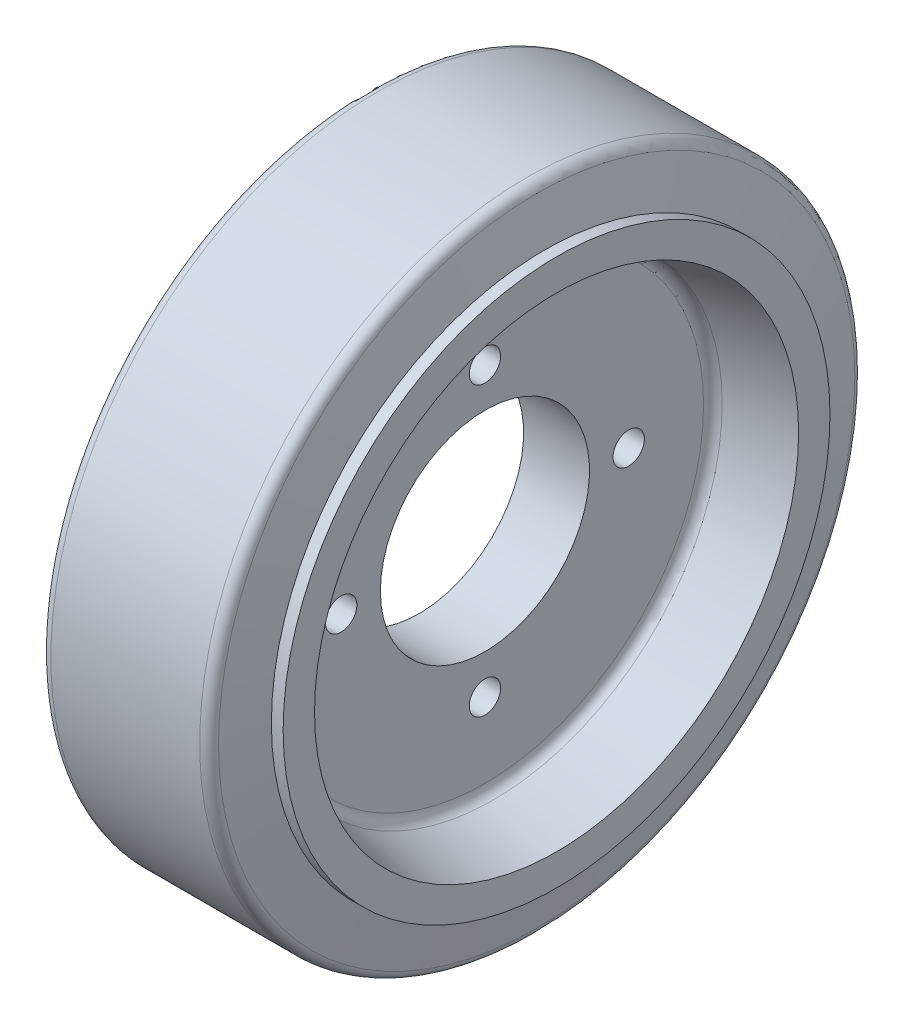
ISO-10303-21;
HEADER;
FILE_DESCRIPTION(('STEP AP214'),'2;1');
FILE_NAME('part.step','',(''),(''),'','','');
FILE_SCHEMA(('AUTOMOTIVE_DESIGN { 1 0 10303 214 1 1 1 1 }'));
ENDSEC;
DATA;
#1=APPLICATION_CONTEXT('core data for automotive mechanical design processes');
#2=APPLICATION_PROTOCOL_DEFINITION('international standard','automotive_design',2000,#1);
#3=PRODUCT_CONTEXT('',#1,'mechanical');
#4=PRODUCT('Part','Part','',(#3));
#5=PRODUCT_RELATED_PRODUCT_CATEGORY('part','',(#4));
#6=PRODUCT_DEFINITION_FORMATION('','',#4);
#7=PRODUCT_DEFINITION_CONTEXT('part definition',#1,'design');
#8=PRODUCT_DEFINITION('design','',#6,#7);
#9=PRODUCT_DEFINITION_SHAPE('','',#8);
#10=(LENGTH_UNIT() NAMED_UNIT(*) SI_UNIT(.MILLI.,.METRE.));
#11=(NAMED_UNIT(*) PLANE_ANGLE_UNIT() SI_UNIT($,.RADIAN.));
#12=(NAMED_UNIT(*) SI_UNIT($,.STERADIAN.) SOLID_ANGLE_UNIT());
#13=UNCERTAINTY_MEASURE_WITH_UNIT(LENGTH_MEASURE(1.E-05),#10,'distance_accuracy_value','');
#14=(GEOMETRIC_REPRESENTATION_CONTEXT(3) GLOBAL_UNCERTAINTY_ASSIGNED_CONTEXT((#13)) GLOBAL_UNIT_ASSIGNED_CONTEXT((#10,
#11,#12)) REPRESENTATION_CONTEXT('',''));
#15=CARTESIAN_POINT('',(0.,0.,0.));
#16=DIRECTION('',(0.,0.,1.));
#17=DIRECTION('',(1.,0.,0.));
#18=AXIS2_PLACEMENT_3D('',#15,#16,#17);
#19=CARTESIAN_POINT('',(15.9,0.,0.));
#20=DIRECTION('',(-1.,0.,0.));
#21=DIRECTION('',(0.,0.,1.));
#22=AXIS2_PLACEMENT_3D('',#19,#20,#21);
#23=CONICAL_SURFACE('',#22,62.5,1.39137423336047);
#24=CARTESIAN_POINT('',(16.1980092545903,0.,0.));
#25=DIRECTION('',(1.,0.,0.));
#26=DIRECTION('',(0.,0.,-1.));
#27=AXIS2_PLACEMENT_3D('',#24,#25,#26);
#28=CIRCLE('',#27,60.8569219476642);
#29=CARTESIAN_POINT('',(16.1980092545903,0.,-60.8569219476642));
#30=VERTEX_POINT('',#29);
#31=EDGE_CURVE('E10',#30,#30,#28,.T.);
#32=ORIENTED_EDGE('',*,*,#31,.T.);
#33=EDGE_LOOP('',(#32));
#34=FACE_BOUND('',#33,.T.);
#35=CARTESIAN_POINT('',(17.75,0.,0.));
#36=DIRECTION('',(-1.,0.,0.));
#37=DIRECTION('',(0.,0.,1.));
#38=AXIS2_PLACEMENT_3D('',#35,#36,#37);
#39=CIRCLE('',#38,52.3);
#40=CARTESIAN_POINT('',(17.75,0.,52.3));
#41=VERTEX_POINT('',#40);
#42=EDGE_CURVE('E74',#41,#41,#39,.T.);
#43=ORIENTED_EDGE('',*,*,#42,.T.);
#44=EDGE_LOOP('',(#43));
#45=FACE_BOUND('',#44,.T.);
#46=ADVANCED_FACE('F42',(#34,#45),#23,.T.);
#47=CARTESIAN_POINT('',(0.,0.,0.));
#48=DIRECTION('',(-1.,0.,0.));
#49=DIRECTION('',(0.,0.,1.));
#50=AXIS2_PLACEMENT_3D('',#47,#48,#49);
#51=CYLINDRICAL_SURFACE('',#50,52.3);
#52=CARTESIAN_POINT('',(20.,0.,0.));
#53=DIRECTION('',(-1.,0.,0.));
#54=DIRECTION('',(0.,0.,1.));
#55=AXIS2_PLACEMENT_3D('',#52,#53,#54);
#56=CIRCLE('',#55,52.3);
#57=CARTESIAN_POINT('',(20.,0.,52.3));
#58=VERTEX_POINT('',#57);
#59=EDGE_CURVE('E77',#58,#58,#56,.T.);
#60=ORIENTED_EDGE('',*,*,#59,.T.);
#61=EDGE_LOOP('',(#60));
#62=FACE_BOUND('',#61,.T.);
#63=ORIENTED_EDGE('',*,*,#42,.F.);
#64=EDGE_LOOP('',(#63));
#65=FACE_BOUND('',#64,.T.);
#66=ADVANCED_FACE('F155',(#62,#65),#51,.T.);
#67=CARTESIAN_POINT('',(20.,-52.3,0.));
#68=DIRECTION('',(1.,0.,0.));
#69=DIRECTION('',(0.,0.,-1.));
#70=AXIS2_PLACEMENT_3D('',#67,#68,#69);
#71=PLANE('',#70);
#72=CARTESIAN_POINT('',(20.,0.,0.));
#73=DIRECTION('',(-1.,0.,0.));
#74=DIRECTION('',(0.,0.,1.));
#75=AXIS2_PLACEMENT_3D('',#72,#73,#74);
#76=CIRCLE('',#75,46.3);
#77=CARTESIAN_POINT('',(20.,0.,46.3));
#78=VERTEX_POINT('',#77);
#79=EDGE_CURVE('E80',#78,#78,#76,.T.);
#80=ORIENTED_EDGE('',*,*,#79,.T.);
#81=EDGE_LOOP('',(#80));
#82=FACE_BOUND('',#81,.T.);
#83=ORIENTED_EDGE('',*,*,#59,.F.);
#84=EDGE_LOOP('',(#83));
#85=FACE_BOUND('',#84,.T.);
#86=ADVANCED_FACE('F160',(#82,#85),#71,.T.);
#87=CARTESIAN_POINT('',(20.,0.,0.));
#88=DIRECTION('',(1.,0.,0.));
#89=DIRECTION('',(0.,0.,-1.));
#90=AXIS2_PLACEMENT_3D('',#87,#88,#89);
#91=CONICAL_SURFACE('',#90,46.3,0.205103886501625);
#92=CARTESIAN_POINT('',(7.89266225994668,0.,0.));
#93=DIRECTION('',(1.,0.,0.));
#94=DIRECTION('',(0.,0.,-1.));
#95=AXIS2_PLACEMENT_3D('',#92,#93,#94);
#96=CIRCLE('',#95,43.7813202511568);
#97=CARTESIAN_POINT('',(7.89266225994668,0.,-43.7813202511568));
#98=VERTEX_POINT('',#97);
#99=EDGE_CURVE('E71',#98,#98,#96,.F.);
#100=ORIENTED_EDGE('',*,*,#99,.T.);
#101=EDGE_LOOP('',(#100));
#102=FACE_BOUND('',#101,.T.);
#103=ORIENTED_EDGE('',*,*,#79,.F.);
#104=EDGE_LOOP('',(#103));
#105=FACE_BOUND('',#104,.T.);
#106=ADVANCED_FACE('F167',(#102,#105),#91,.F.);
#107=CARTESIAN_POINT('',(6.3,-43.45,0.));
#108=DIRECTION('',(1.,0.,0.));
#109=DIRECTION('',(0.,0.,-1.));
#110=AXIS2_PLACEMENT_3D('',#107,#108,#109);
#111=PLANE('',#110);
#112=CARTESIAN_POINT('',(6.3,0.,27.5));
#113=DIRECTION('',(1.,0.,0.));
#114=DIRECTION('',(0.,0.,-1.));
#115=AXIS2_PLACEMENT_3D('',#112,#113,#114);
#116=CIRCLE('',#115,3.);
#117=CARTESIAN_POINT('',(6.3,0.,24.5));
#118=VERTEX_POINT('',#117);
#119=EDGE_CURVE('E113',#118,#118,#116,.T.);
#120=ORIENTED_EDGE('',*,*,#119,.F.);
#121=EDGE_LOOP('',(#120));
#122=FACE_BOUND('',#121,.T.);
#123=CARTESIAN_POINT('',(6.3,-27.5,0.));
#124=DIRECTION('',(1.,0.,0.));
#125=DIRECTION('',(0.,0.,-1.));
#126=AXIS2_PLACEMENT_3D('',#123,#124,#125);
#127=CIRCLE('',#126,3.);
#128=CARTESIAN_POINT('',(6.3,-27.5,-3.));
#129=VERTEX_POINT('',#128);
#130=EDGE_CURVE('E107',#129,#129,#127,.T.);
#131=ORIENTED_EDGE('',*,*,#130,.F.);
#132=EDGE_LOOP('',(#131));
#133=FACE_BOUND('',#132,.T.);
#134=CARTESIAN_POINT('',(6.3,0.,-27.5));
#135=DIRECTION('',(1.,0.,0.));
#136=DIRECTION('',(0.,0.,-1.));
#137=AXIS2_PLACEMENT_3D('',#134,#135,#136);
#138=CIRCLE('',#137,3.);
#139=CARTESIAN_POINT('',(6.3,0.,-30.5));
#140=VERTEX_POINT('',#139);
#141=EDGE_CURVE('E101',#140,#140,#138,.T.);
#142=ORIENTED_EDGE('',*,*,#141,.F.);
#143=EDGE_LOOP('',(#142));
#144=FACE_BOUND('',#143,.T.);
#145=CARTESIAN_POINT('',(6.3,27.5,0.));
#146=DIRECTION('',(1.,0.,0.));
#147=DIRECTION('',(0.,0.,-1.));
#148=AXIS2_PLACEMENT_3D('',#145,#146,#147);
#149=CIRCLE('',#148,3.);
#150=CARTESIAN_POINT('',(6.3,27.5,-3.));
#151=VERTEX_POINT('',#150);
#152=EDGE_CURVE('E95',#151,#151,#149,.T.);
#153=ORIENTED_EDGE('',*,*,#152,.F.);
#154=EDGE_LOOP('',(#153));
#155=FACE_BOUND('',#154,.T.);
#156=CARTESIAN_POINT('',(6.3,0.,0.));
#157=DIRECTION('',(1.,0.,0.));
#158=DIRECTION('',(0.,0.,-1.));
#159=AXIS2_PLACEMENT_3D('',#156,#157,#158);
#160=CIRCLE('',#159,20.);
#161=CARTESIAN_POINT('',(6.3,0.,20.));
#162=VERTEX_POINT('',#161);
#163=EDGE_CURVE('E92',#162,#162,#160,.T.);
#164=ORIENTED_EDGE('',*,*,#163,.F.);
#165=EDGE_LOOP('',(#164));
#166=FACE_BOUND('',#165,.T.);
#167=CARTESIAN_POINT('',(6.3,0.,0.));
#168=DIRECTION('',(1.,0.,0.));
#169=DIRECTION('',(0.,0.,-1.));
#170=AXIS2_PLACEMENT_3D('',#167,#168,#169);
#171=CIRCLE('',#170,41.8232405884443);
#172=CARTESIAN_POINT('',(6.3,0.,-41.8232405884443));
#173=VERTEX_POINT('',#172);
#174=EDGE_CURVE('E68',#173,#173,#171,.T.);
#175=ORIENTED_EDGE('',*,*,#174,.T.);
#176=EDGE_LOOP('',(#175));
#177=FACE_BOUND('',#176,.T.);
#178=ADVANCED_FACE('F126',(#122,#133,#144,#155,#166,#177),#111,.T.);
#179=CARTESIAN_POINT('',(-6.3,-43.45,0.));
#180=DIRECTION('',(-1.,0.,0.));
#181=DIRECTION('',(0.,0.,1.));
#182=AXIS2_PLACEMENT_3D('',#179,#180,#181);
#183=PLANE('',#182);
#184=CARTESIAN_POINT('',(-6.3,0.,27.5));
#185=DIRECTION('',(-1.,0.,0.));
#186=DIRECTION('',(0.,0.,1.));
#187=AXIS2_PLACEMENT_3D('',#184,#185,#186);
#188=CIRCLE('',#187,3.);
#189=CARTESIAN_POINT('',(-6.3,0.,30.5));
#190=VERTEX_POINT('',#189);
#191=EDGE_CURVE('E116',#190,#190,#188,.T.);
#192=ORIENTED_EDGE('',*,*,#191,.F.);
#193=EDGE_LOOP('',(#192));
#194=FACE_BOUND('',#193,.T.);
#195=CARTESIAN_POINT('',(-6.3,-27.5,0.));
#196=DIRECTION('',(-1.,0.,0.));
#197=DIRECTION('',(0.,0.,1.));
#198=AXIS2_PLACEMENT_3D('',#195,#196,#197);
#199=CIRCLE('',#198,3.);
#200=CARTESIAN_POINT('',(-6.3,-27.5,3.));
#201=VERTEX_POINT('',#200);
#202=EDGE_CURVE('E110',#201,#201,#199,.T.);
#203=ORIENTED_EDGE('',*,*,#202,.F.);
#204=EDGE_LOOP('',(#203));
#205=FACE_BOUND('',#204,.T.);
#206=CARTESIAN_POINT('',(-6.3,0.,-27.5));
#207=DIRECTION('',(-1.,0.,0.));
#208=DIRECTION('',(0.,0.,1.));
#209=AXIS2_PLACEMENT_3D('',#206,#207,#208);
#210=CIRCLE('',#209,3.);
#211=CARTESIAN_POINT('',(-6.3,0.,-24.5));
#212=VERTEX_POINT('',#211);
#213=EDGE_CURVE('E104',#212,#212,#210,.T.);
#214=ORIENTED_EDGE('',*,*,#213,.F.);
#215=EDGE_LOOP('',(#214));
#216=FACE_BOUND('',#215,.T.);
#217=CARTESIAN_POINT('',(-6.3,27.5,0.));
#218=DIRECTION('',(-1.,0.,0.));
#219=DIRECTION('',(0.,0.,1.));
#220=AXIS2_PLACEMENT_3D('',#217,#218,#219);
#221=CIRCLE('',#220,3.);
#222=CARTESIAN_POINT('',(-6.3,27.5,3.));
#223=VERTEX_POINT('',#222);
#224=EDGE_CURVE('E98',#223,#223,#221,.T.);
#225=ORIENTED_EDGE('',*,*,#224,.F.);
#226=EDGE_LOOP('',(#225));
#227=FACE_BOUND('',#226,.T.);
#228=CARTESIAN_POINT('',(-6.3,0.,0.));
#229=DIRECTION('',(-1.,0.,0.));
#230=DIRECTION('',(0.,0.,1.));
#231=AXIS2_PLACEMENT_3D('',#228,#229,#230);
#232=CIRCLE('',#231,20.);
#233=CARTESIAN_POINT('',(-6.3,0.,20.));
#234=VERTEX_POINT('',#233);
#235=EDGE_CURVE('E46',#234,#234,#232,.T.);
#236=ORIENTED_EDGE('',*,*,#235,.F.);
#237=EDGE_LOOP('',(#236));
#238=FACE_BOUND('',#237,.T.);
#239=CARTESIAN_POINT('',(-6.3,0.,0.));
#240=DIRECTION('',(-1.,0.,0.));
#241=DIRECTION('',(0.,0.,1.));
#242=AXIS2_PLACEMENT_3D('',#239,#240,#241);
#243=CIRCLE('',#242,41.8232405884443);
#244=CARTESIAN_POINT('',(-6.3,0.,41.8232405884443));
#245=VERTEX_POINT('',#244);
#246=EDGE_CURVE('E65',#245,#245,#243,.T.);
#247=ORIENTED_EDGE('',*,*,#246,.T.);
#248=EDGE_LOOP('',(#247));
#249=FACE_BOUND('',#248,.T.);
#250=ADVANCED_FACE('F122',(#194,#205,#216,#227,#238,#249),#183,.T.);
#251=CARTESIAN_POINT('',(-6.3,0.,0.));
#252=DIRECTION('',(-1.,0.,0.));
#253=DIRECTION('',(0.,0.,1.));
#254=AXIS2_PLACEMENT_3D('',#251,#252,#253);
#255=CONICAL_SURFACE('',#254,43.45,0.205103886501625);
#256=CARTESIAN_POINT('',(-7.89266225994668,0.,0.));
#257=DIRECTION('',(-1.,0.,0.));
#258=DIRECTION('',(0.,0.,1.));
#259=AXIS2_PLACEMENT_3D('',#256,#257,#258);
#260=CIRCLE('',#259,43.7813202511568);
#261=CARTESIAN_POINT('',(-7.89266225994668,0.,43.7813202511568));
#262=VERTEX_POINT('',#261);
#263=EDGE_CURVE('E62',#262,#262,#260,.F.);
#264=ORIENTED_EDGE('',*,*,#263,.T.);
#265=EDGE_LOOP('',(#264));
#266=FACE_BOUND('',#265,.T.);
#267=CARTESIAN_POINT('',(-20.,0.,0.));
#268=DIRECTION('',(-1.,0.,0.));
#269=DIRECTION('',(0.,0.,1.));
#270=AXIS2_PLACEMENT_3D('',#267,#268,#269);
#271=CIRCLE('',#270,46.3);
#272=CARTESIAN_POINT('',(-20.,0.,46.3));
#273=VERTEX_POINT('',#272);
#274=EDGE_CURVE('E83',#273,#273,#271,.T.);
#275=ORIENTED_EDGE('',*,*,#274,.T.);
#276=EDGE_LOOP('',(#275));
#277=FACE_BOUND('',#276,.T.);
#278=ADVANCED_FACE('F125',(#266,#277),#255,.F.);
#279=CARTESIAN_POINT('',(-20.,-52.3,0.));
#280=DIRECTION('',(-1.,0.,0.));
#281=DIRECTION('',(0.,0.,1.));
#282=AXIS2_PLACEMENT_3D('',#279,#280,#281);
#283=PLANE('',#282);
#284=CARTESIAN_POINT('',(-20.,0.,0.));
#285=DIRECTION('',(-1.,0.,0.));
#286=DIRECTION('',(0.,0.,1.));
#287=AXIS2_PLACEMENT_3D('',#284,#285,#286);
#288=CIRCLE('',#287,52.3);
#289=CARTESIAN_POINT('',(-20.,0.,52.3));
#290=VERTEX_POINT('',#289);
#291=EDGE_CURVE('E86',#290,#290,#288,.T.);
#292=ORIENTED_EDGE('',*,*,#291,.T.);
#293=EDGE_LOOP('',(#292));
#294=FACE_BOUND('',#293,.T.);
#295=ORIENTED_EDGE('',*,*,#274,.F.);
#296=EDGE_LOOP('',(#295));
#297=FACE_BOUND('',#296,.T.);
#298=ADVANCED_FACE('F177',(#294,#297),#283,.T.);
#299=CARTESIAN_POINT('',(0.,0.,0.));
#300=DIRECTION('',(-1.,0.,0.));
#301=DIRECTION('',(0.,0.,1.));
#302=AXIS2_PLACEMENT_3D('',#299,#300,#301);
#303=CYLINDRICAL_SURFACE('',#302,52.3);
#304=CARTESIAN_POINT('',(-17.75,0.,0.));
#305=DIRECTION('',(-1.,0.,0.));
#306=DIRECTION('',(0.,0.,1.));
#307=AXIS2_PLACEMENT_3D('',#304,#305,#306);
#308=CIRCLE('',#307,52.3);
#309=CARTESIAN_POINT('',(-17.75,0.,52.3));
#310=VERTEX_POINT('',#309);
#311=EDGE_CURVE('E89',#310,#310,#308,.T.);
#312=ORIENTED_EDGE('',*,*,#311,.T.);
#313=EDGE_LOOP('',(#312));
#314=FACE_BOUND('',#313,.T.);
#315=ORIENTED_EDGE('',*,*,#291,.F.);
#316=EDGE_LOOP('',(#315));
#317=FACE_BOUND('',#316,.T.);
#318=ADVANCED_FACE('F181',(#314,#317),#303,.T.);
#319=CARTESIAN_POINT('',(-17.75,0.,0.));
#320=DIRECTION('',(1.,0.,0.));
#321=DIRECTION('',(0.,0.,-1.));
#322=AXIS2_PLACEMENT_3D('',#319,#320,#321);
#323=CONICAL_SURFACE('',#322,52.3,1.39137423336047);
#324=CARTESIAN_POINT('',(-16.1980092545903,0.,0.));
#325=DIRECTION('',(-1.,0.,0.));
#326=DIRECTION('',(0.,0.,1.));
#327=AXIS2_PLACEMENT_3D('',#324,#325,#326);
#328=CIRCLE('',#327,60.8569219476642);
#329=CARTESIAN_POINT('',(-16.1980092545903,0.,60.8569219476642));
#330=VERTEX_POINT('',#329);
#331=EDGE_CURVE('E59',#330,#330,#328,.T.);
#332=ORIENTED_EDGE('',*,*,#331,.T.);
#333=EDGE_LOOP('',(#332));
#334=FACE_BOUND('',#333,.T.);
#335=ORIENTED_EDGE('',*,*,#311,.F.);
#336=EDGE_LOOP('',(#335));
#337=FACE_BOUND('',#336,.T.);
#338=ADVANCED_FACE('F185',(#334,#337),#323,.T.);
#339=CARTESIAN_POINT('',(0.,0.,0.));
#340=DIRECTION('',(-1.,0.,0.));
#341=DIRECTION('',(0.,0.,1.));
#342=AXIS2_PLACEMENT_3D('',#339,#340,#341);
#343=CYLINDRICAL_SURFACE('',#342,62.5);
#344=CARTESIAN_POINT('',(-14.2301152728739,0.,0.));
#345=DIRECTION('',(1.,0.,0.));
#346=DIRECTION('',(0.,0.,-1.));
#347=AXIS2_PLACEMENT_3D('',#344,#345,#346);
#348=CIRCLE('',#347,62.5);
#349=CARTESIAN_POINT('',(-14.2301152728739,0.,-62.5));
#350=VERTEX_POINT('',#349);
#351=EDGE_CURVE('E50',#350,#350,#348,.T.);
#352=ORIENTED_EDGE('',*,*,#351,.T.);
#353=EDGE_LOOP('',(#352));
#354=FACE_BOUND('',#353,.T.);
#355=CARTESIAN_POINT('',(14.2301152728739,0.,0.));
#356=DIRECTION('',(1.,0.,0.));
#357=DIRECTION('',(0.,0.,-1.));
#358=AXIS2_PLACEMENT_3D('',#355,#356,#357);
#359=CIRCLE('',#358,62.5);
#360=CARTESIAN_POINT('',(14.2301152728739,0.,-62.5));
#361=VERTEX_POINT('',#360);
#362=EDGE_CURVE('E54',#361,#361,#359,.F.);
#363=ORIENTED_EDGE('',*,*,#362,.T.);
#364=EDGE_LOOP('',(#363));
#365=FACE_BOUND('',#364,.T.);
#366=ADVANCED_FACE('F150',(#354,#365),#343,.T.);
#367=CARTESIAN_POINT('',(8.3,0.,0.));
#368=DIRECTION('',(1.,0.,0.));
#369=DIRECTION('',(0.,0.,-1.));
#370=AXIS2_PLACEMENT_3D('',#367,#368,#369);
#371=TOROIDAL_SURFACE('',#370,41.8232405884443,2.);
#372=ORIENTED_EDGE('',*,*,#174,.F.);
#373=EDGE_LOOP('',(#372));
#374=FACE_BOUND('',#373,.T.);
#375=ORIENTED_EDGE('',*,*,#99,.F.);
#376=EDGE_LOOP('',(#375));
#377=FACE_BOUND('',#376,.T.);
#378=ADVANCED_FACE('F142',(#374,#377),#371,.F.);
#379=CARTESIAN_POINT('',(-8.3,0.,0.));
#380=DIRECTION('',(-1.,0.,0.));
#381=DIRECTION('',(0.,0.,1.));
#382=AXIS2_PLACEMENT_3D('',#379,#380,#381);
#383=TOROIDAL_SURFACE('',#382,41.8232405884443,2.);
#384=ORIENTED_EDGE('',*,*,#263,.F.);
#385=EDGE_LOOP('',(#384));
#386=FACE_BOUND('',#385,.T.);
#387=ORIENTED_EDGE('',*,*,#246,.F.);
#388=EDGE_LOOP('',(#387));
#389=FACE_BOUND('',#388,.T.);
#390=ADVANCED_FACE('F139',(#386,#389),#383,.F.);
#391=CARTESIAN_POINT('',(-14.2301152728739,0.,0.));
#392=DIRECTION('',(1.,0.,0.));
#393=DIRECTION('',(0.,0.,-1.));
#394=AXIS2_PLACEMENT_3D('',#391,#392,#393);
#395=TOROIDAL_SURFACE('',#394,60.5,2.);
#396=ORIENTED_EDGE('',*,*,#351,.F.);
#397=EDGE_LOOP('',(#396));
#398=FACE_BOUND('',#397,.T.);
#399=ORIENTED_EDGE('',*,*,#331,.F.);
#400=EDGE_LOOP('',(#399));
#401=FACE_BOUND('',#400,.T.);
#402=ADVANCED_FACE('F141',(#398,#401),#395,.T.);
#403=CARTESIAN_POINT('',(14.2301152728739,0.,0.));
#404=DIRECTION('',(1.,0.,0.));
#405=DIRECTION('',(0.,0.,-1.));
#406=AXIS2_PLACEMENT_3D('',#403,#404,#405);
#407=TOROIDAL_SURFACE('',#406,60.5,2.);
#408=ORIENTED_EDGE('',*,*,#31,.F.);
#409=EDGE_LOOP('',(#408));
#410=FACE_BOUND('',#409,.T.);
#411=ORIENTED_EDGE('',*,*,#362,.F.);
#412=EDGE_LOOP('',(#411));
#413=FACE_BOUND('',#412,.T.);
#414=ADVANCED_FACE('F44',(#410,#413),#407,.T.);
#415=CARTESIAN_POINT('',(22.2,0.,0.));
#416=DIRECTION('',(-1.,0.,0.));
#417=DIRECTION('',(0.,0.,1.));
#418=AXIS2_PLACEMENT_3D('',#415,#416,#417);
#419=CYLINDRICAL_SURFACE('',#418,20.);
#420=CARTESIAN_POINT('',(6.3,0.,20.));
#421=CARTESIAN_POINT('',(6.16875,0.,20.));
#422=CARTESIAN_POINT('',(6.0375,0.,20.));
#423=CARTESIAN_POINT('',(5.775,0.,20.));
#424=CARTESIAN_POINT('',(5.64375,0.,20.));
#425=CARTESIAN_POINT('',(5.38125,0.,20.));
#426=CARTESIAN_POINT('',(5.25,0.,20.));
#427=CARTESIAN_POINT('',(4.9875,0.,20.));
#428=CARTESIAN_POINT('',(4.85625,0.,20.));
#429=CARTESIAN_POINT('',(4.59375,0.,20.));
#430=CARTESIAN_POINT('',(4.4625,0.,20.));
#431=CARTESIAN_POINT('',(4.2,0.,20.));
#432=CARTESIAN_POINT('',(4.06875,0.,20.));
#433=CARTESIAN_POINT('',(3.80625,0.,20.));
#434=CARTESIAN_POINT('',(3.675,0.,20.));
#435=CARTESIAN_POINT('',(3.4125,0.,20.));
#436=CARTESIAN_POINT('',(3.28125,0.,20.));
#437=CARTESIAN_POINT('',(3.01875,0.,20.));
#438=CARTESIAN_POINT('',(2.8875,0.,20.));
#439=CARTESIAN_POINT('',(2.625,0.,20.));
#440=CARTESIAN_POINT('',(2.49375,0.,20.));
#441=CARTESIAN_POINT('',(2.23125,0.,20.));
#442=CARTESIAN_POINT('',(2.1,0.,20.));
#443=CARTESIAN_POINT('',(1.8375,0.,20.));
#444=CARTESIAN_POINT('',(1.70625,0.,20.));
#445=CARTESIAN_POINT('',(1.44375,0.,20.));
#446=CARTESIAN_POINT('',(1.3125,0.,20.));
#447=CARTESIAN_POINT('',(1.05,0.,20.));
#448=CARTESIAN_POINT('',(0.918750000000001,0.,20.));
#449=CARTESIAN_POINT('',(0.656249999999999,0.,20.));
#450=CARTESIAN_POINT('',(0.524999999999999,0.,20.));
#451=CARTESIAN_POINT('',(0.262499999999999,0.,20.));
#452=CARTESIAN_POINT('',(0.131249999999999,0.,20.));
#453=CARTESIAN_POINT('',(-0.131249999999999,0.,20.));
#454=CARTESIAN_POINT('',(-0.262499999999999,0.,20.));
#455=CARTESIAN_POINT('',(-0.524999999999999,0.,20.));
#456=CARTESIAN_POINT('',(-0.656249999999999,0.,20.));
#457=CARTESIAN_POINT('',(-0.918750000000001,0.,20.));
#458=CARTESIAN_POINT('',(-1.05,0.,20.));
#459=CARTESIAN_POINT('',(-1.3125,0.,20.));
#460=CARTESIAN_POINT('',(-1.44375,0.,20.));
#461=CARTESIAN_POINT('',(-1.70625,0.,20.));
#462=CARTESIAN_POINT('',(-1.8375,0.,20.));
#463=CARTESIAN_POINT('',(-2.1,0.,20.));
#464=CARTESIAN_POINT('',(-2.23125,0.,20.));
#465=CARTESIAN_POINT('',(-2.49375,0.,20.));
#466=CARTESIAN_POINT('',(-2.625,0.,20.));
#467=CARTESIAN_POINT('',(-2.8875,0.,20.));
#468=CARTESIAN_POINT('',(-3.01875,0.,20.));
#469=CARTESIAN_POINT('',(-3.28125,0.,20.));
#470=CARTESIAN_POINT('',(-3.4125,0.,20.));
#471=CARTESIAN_POINT('',(-3.675,0.,20.));
#472=CARTESIAN_POINT('',(-3.80625,0.,20.));
#473=CARTESIAN_POINT('',(-4.06875,0.,20.));
#474=CARTESIAN_POINT('',(-4.2,0.,20.));
#475=CARTESIAN_POINT('',(-4.4625,0.,20.));
#476=CARTESIAN_POINT('',(-4.59375,0.,20.));
#477=CARTESIAN_POINT('',(-4.85625,0.,20.));
#478=CARTESIAN_POINT('',(-4.9875,0.,20.));
#479=CARTESIAN_POINT('',(-5.25,0.,20.));
#480=CARTESIAN_POINT('',(-5.38125,0.,20.));
#481=CARTESIAN_POINT('',(-5.64375,0.,20.));
#482=CARTESIAN_POINT('',(-5.775,0.,20.));
#483=CARTESIAN_POINT('',(-6.0375,0.,20.));
#484=CARTESIAN_POINT('',(-6.16875,0.,20.));
#485=CARTESIAN_POINT('',(-6.3,0.,20.));
#486=B_SPLINE_CURVE_WITH_KNOTS('',3,(#420,#421,#422,#423,#424,#425,#426,#427,#428,#429,#430,
#431,#432,#433,#434,#435,#436,#437,#438,#439,#440,#441,#442,#443,#444,#445,#446,#447,#448,#449,
#450,#451,#452,#453,#454,#455,#456,#457,#458,#459,#460,#461,#462,#463,#464,#465,#466,#467,#468,
#469,#470,#471,#472,#473,#474,#475,#476,#477,#478,#479,#480,#481,#482,#483,#484,#485),
.UNSPECIFIED.,.F.,.F.,(4,2,2,2,2,2,2,2,2,2,2,2,2,2,2,2,2,2,2,2,2,2,2,2,2,2,2,2,2,2,2,2,4),(0.,
0.393749999999998,0.7875,1.18125,1.575,1.96875,2.3625,2.75625,3.15,3.54375,3.9375,4.33125,4.725,
5.11875,5.5125,5.90625,6.3,6.69375,7.0875,7.48125,7.875,8.26875,8.6625,9.05625,9.45,9.84375,
10.2375,10.63125,11.025,11.41875,11.8125,12.20625,12.6),.UNSPECIFIED.);
#487=EDGE_CURVE('BSEAM193',#162,#234,#486,.T.);
#488=ORIENTED_EDGE('',*,*,#163,.T.);
#489=ORIENTED_EDGE('',*,*,#235,.T.);
#490=ORIENTED_EDGE('',*,*,#487,.T.);
#491=ORIENTED_EDGE('',*,*,#487,.F.);
#492=EDGE_LOOP('',(#488,#490,#489,#491));
#493=FACE_BOUND('',#492,.T.);
#494=ADVANCED_FACE('F193',(#493),#419,.F.);
#495=CARTESIAN_POINT('',(20.,27.5,0.));
#496=DIRECTION('',(-1.,0.,0.));
#497=DIRECTION('',(0.,0.,1.));
#498=AXIS2_PLACEMENT_3D('',#495,#496,#497);
#499=CYLINDRICAL_SURFACE('',#498,3.);
#500=ORIENTED_EDGE('',*,*,#152,.T.);
#501=EDGE_LOOP('',(#500));
#502=FACE_BOUND('',#501,.T.);
#503=ORIENTED_EDGE('',*,*,#224,.T.);
#504=EDGE_LOOP('',(#503));
#505=FACE_BOUND('',#504,.T.);
#506=ADVANCED_FACE('F196',(#502,#505),#499,.F.);
#507=CARTESIAN_POINT('',(20.,0.,-27.5));
#508=DIRECTION('',(-1.,0.,0.));
#509=DIRECTION('',(0.,0.,1.));
#510=AXIS2_PLACEMENT_3D('',#507,#508,#509);
#511=CYLINDRICAL_SURFACE('',#510,3.);
#512=ORIENTED_EDGE('',*,*,#141,.T.);
#513=EDGE_LOOP('',(#512));
#514=FACE_BOUND('',#513,.T.);
#515=ORIENTED_EDGE('',*,*,#213,.T.);
#516=EDGE_LOOP('',(#515));
#517=FACE_BOUND('',#516,.T.);
#518=ADVANCED_FACE('F200',(#514,#517),#511,.F.);
#519=CARTESIAN_POINT('',(20.,-27.5,0.));
#520=DIRECTION('',(-1.,0.,0.));
#521=DIRECTION('',(0.,0.,1.));
#522=AXIS2_PLACEMENT_3D('',#519,#520,#521);
#523=CYLINDRICAL_SURFACE('',#522,3.);
#524=ORIENTED_EDGE('',*,*,#130,.T.);
#525=EDGE_LOOP('',(#524));
#526=FACE_BOUND('',#525,.T.);
#527=ORIENTED_EDGE('',*,*,#202,.T.);
#528=EDGE_LOOP('',(#527));
#529=FACE_BOUND('',#528,.T.);
#530=ADVANCED_FACE('F204',(#526,#529),#523,.F.);
#531=CARTESIAN_POINT('',(20.,0.,27.5));
#532=DIRECTION('',(-1.,0.,0.));
#533=DIRECTION('',(0.,0.,1.));
#534=AXIS2_PLACEMENT_3D('',#531,#532,#533);
#535=CYLINDRICAL_SURFACE('',#534,3.);
#536=ORIENTED_EDGE('',*,*,#119,.T.);
#537=EDGE_LOOP('',(#536));
#538=FACE_BOUND('',#537,.T.);
#539=ORIENTED_EDGE('',*,*,#191,.T.);
#540=EDGE_LOOP('',(#539));
#541=FACE_BOUND('',#540,.T.);
#542=ADVANCED_FACE('F120',(#538,#541),#535,.F.);
#543=CLOSED_SHELL('',(#46,#66,#86,#106,#178,#250,#278,#298,#318,#338,#366,#378,#390,#402,#414,
#494,#506,#518,#530,#542));
#544=MANIFOLD_SOLID_BREP('B2',#543);
#545=ADVANCED_BREP_SHAPE_REPRESENTATION('',(#18,#544),#14);
#546=SHAPE_DEFINITION_REPRESENTATION(#9,#545);
ENDSEC;
END-ISO-10303-21;
